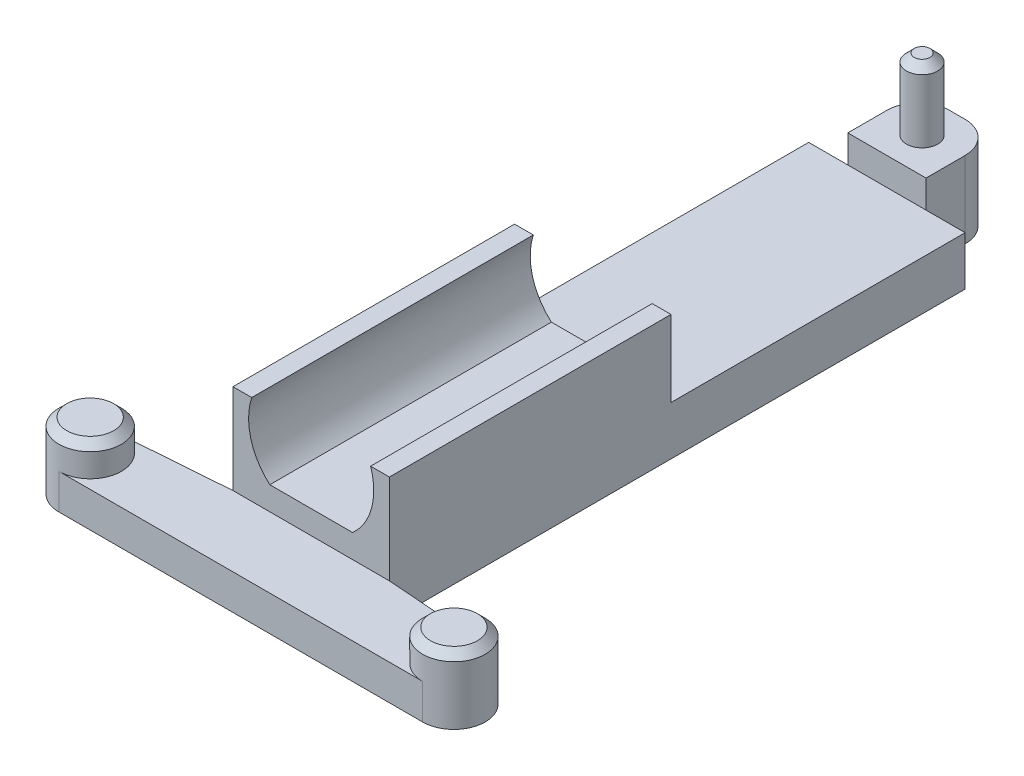
ISO-10303-21;
HEADER;
FILE_DESCRIPTION(('STEP AP214'),'2;1');
FILE_NAME('part.step','',(''),(''),'','','');
FILE_SCHEMA(('AUTOMOTIVE_DESIGN { 1 0 10303 214 1 1 1 1 }'));
ENDSEC;
DATA;
#1=APPLICATION_CONTEXT('core data for automotive mechanical design processes');
#2=APPLICATION_PROTOCOL_DEFINITION('international standard','automotive_design',2000,#1);
#3=PRODUCT_CONTEXT('',#1,'mechanical');
#4=PRODUCT('Part','Part','',(#3));
#5=PRODUCT_RELATED_PRODUCT_CATEGORY('part','',(#4));
#6=PRODUCT_DEFINITION_FORMATION('','',#4);
#7=PRODUCT_DEFINITION_CONTEXT('part definition',#1,'design');
#8=PRODUCT_DEFINITION('design','',#6,#7);
#9=PRODUCT_DEFINITION_SHAPE('','',#8);
#10=(LENGTH_UNIT() NAMED_UNIT(*) SI_UNIT(.MILLI.,.METRE.));
#11=(NAMED_UNIT(*) PLANE_ANGLE_UNIT() SI_UNIT($,.RADIAN.));
#12=(NAMED_UNIT(*) SI_UNIT($,.STERADIAN.) SOLID_ANGLE_UNIT());
#13=UNCERTAINTY_MEASURE_WITH_UNIT(LENGTH_MEASURE(1.E-05),#10,'distance_accuracy_value','');
#14=(GEOMETRIC_REPRESENTATION_CONTEXT(3) GLOBAL_UNCERTAINTY_ASSIGNED_CONTEXT((#13)) GLOBAL_UNIT_ASSIGNED_CONTEXT((#10,
#11,#12)) REPRESENTATION_CONTEXT('',''));
#15=CARTESIAN_POINT('',(0.,0.,0.));
#16=DIRECTION('',(0.,0.,1.));
#17=DIRECTION('',(1.,0.,0.));
#18=AXIS2_PLACEMENT_3D('',#15,#16,#17);
#19=CARTESIAN_POINT('',(0.,4.5,0.));
#20=DIRECTION('',(0.,1.,0.));
#21=DIRECTION('',(0.,0.,1.));
#22=AXIS2_PLACEMENT_3D('',#19,#20,#21);
#23=PLANE('',#22);
#24=CARTESIAN_POINT('',(71.5,4.5,100.));
#25=DIRECTION('',(0.,1.,0.));
#26=DIRECTION('',(0.,0.,1.));
#27=AXIS2_PLACEMENT_3D('',#24,#25,#26);
#28=CIRCLE('',#27,4.00000000000001);
#29=CARTESIAN_POINT('',(71.5,4.5,96.));
#30=VERTEX_POINT('',#29);
#31=CARTESIAN_POINT('',(71.5,4.5,104.));
#32=VERTEX_POINT('',#31);
#33=EDGE_CURVE('E225',#30,#32,#28,.T.);
#34=ORIENTED_EDGE('',*,*,#33,.F.);
#35=DIRECTION('',(-0.997164120486613,0.,-0.0752576694706879));
#36=VECTOR('',#35,1.);
#37=CARTESIAN_POINT('',(71.5,4.5,96.));
#38=LINE('',#37,#36);
#39=CARTESIAN_POINT('',(58.25,4.5,95.));
#40=VERTEX_POINT('',#39);
#41=EDGE_CURVE('E496',#30,#40,#38,.T.);
#42=ORIENTED_EDGE('',*,*,#41,.T.);
#43=DIRECTION('',(1.,0.,0.));
#44=VECTOR('',#43,1.);
#45=CARTESIAN_POINT('',(0.,4.5,95.));
#46=LINE('',#45,#44);
#47=CARTESIAN_POINT('',(38.25,4.5,95.));
#48=VERTEX_POINT('',#47);
#49=EDGE_CURVE('E216',#48,#40,#46,.T.);
#50=ORIENTED_EDGE('',*,*,#49,.F.);
#51=DIRECTION('',(-0.997164120486613,0.,0.0752576694706878));
#52=VECTOR('',#51,1.);
#53=CARTESIAN_POINT('',(38.25,4.5,95.));
#54=LINE('',#53,#52);
#55=CARTESIAN_POINT('',(25.,4.5,96.));
#56=VERTEX_POINT('',#55);
#57=EDGE_CURVE('E199',#48,#56,#54,.T.);
#58=ORIENTED_EDGE('',*,*,#57,.T.);
#59=CARTESIAN_POINT('',(25.,4.5,100.));
#60=DIRECTION('',(0.,1.,0.));
#61=DIRECTION('',(0.,0.,1.));
#62=AXIS2_PLACEMENT_3D('',#59,#60,#61);
#63=CIRCLE('',#62,4.);
#64=CARTESIAN_POINT('',(25.,4.5,104.));
#65=VERTEX_POINT('',#64);
#66=EDGE_CURVE('E213',#65,#56,#63,.T.);
#67=ORIENTED_EDGE('',*,*,#66,.F.);
#68=DIRECTION('',(1.,0.,0.));
#69=VECTOR('',#68,1.);
#70=CARTESIAN_POINT('',(25.,4.5,104.));
#71=LINE('',#70,#69);
#72=EDGE_CURVE('E219',#65,#32,#71,.T.);
#73=ORIENTED_EDGE('',*,*,#72,.T.);
#74=EDGE_LOOP('',(#34,#42,#50,#58,#67,#73));
#75=FACE_BOUND('',#74,.T.);
#76=ADVANCED_FACE('F47',(#75),#23,.T.);
#77=CARTESIAN_POINT('',(0.,16.,0.));
#78=DIRECTION('',(0.,1.,0.));
#79=DIRECTION('',(0.,0.,1.));
#80=AXIS2_PLACEMENT_3D('',#77,#78,#79);
#81=PLANE('',#80);
#82=DIRECTION('',(0.,0.,-1.));
#83=VECTOR('',#82,1.);
#84=CARTESIAN_POINT('',(40.6506579232147,16.,110.));
#85=LINE('',#84,#83);
#86=CARTESIAN_POINT('',(40.6506579232147,16.,59.));
#87=VERTEX_POINT('',#86);
#88=CARTESIAN_POINT('',(40.6506579232147,16.,95.));
#89=VERTEX_POINT('',#88);
#90=EDGE_CURVE('E247',#87,#89,#85,.F.);
#91=ORIENTED_EDGE('',*,*,#90,.F.);
#92=DIRECTION('',(1.,0.,0.));
#93=VECTOR('',#92,1.);
#94=CARTESIAN_POINT('',(0.,16.,59.));
#95=LINE('',#94,#93);
#96=CARTESIAN_POINT('',(38.25,16.,59.));
#97=VERTEX_POINT('',#96);
#98=EDGE_CURVE('E389',#97,#87,#95,.T.);
#99=ORIENTED_EDGE('',*,*,#98,.F.);
#100=DIRECTION('',(0.,0.,1.));
#101=VECTOR('',#100,1.);
#102=CARTESIAN_POINT('',(38.25,16.,0.));
#103=LINE('',#102,#101);
#104=CARTESIAN_POINT('',(38.25,16.,95.));
#105=VERTEX_POINT('',#104);
#106=EDGE_CURVE('E393',#97,#105,#103,.T.);
#107=ORIENTED_EDGE('',*,*,#106,.T.);
#108=DIRECTION('',(1.,0.,0.));
#109=VECTOR('',#108,1.);
#110=CARTESIAN_POINT('',(0.,16.,95.));
#111=LINE('',#110,#109);
#112=EDGE_CURVE('E397',#105,#89,#111,.T.);
#113=ORIENTED_EDGE('',*,*,#112,.T.);
#114=EDGE_LOOP('',(#91,#99,#107,#113));
#115=FACE_BOUND('',#114,.T.);
#116=ADVANCED_FACE('F529',(#115),#81,.T.);
#117=CARTESIAN_POINT('',(0.,6.25,21.4));
#118=DIRECTION('',(0.,0.,1.));
#119=DIRECTION('',(1.,0.,0.));
#120=AXIS2_PLACEMENT_3D('',#117,#118,#119);
#121=PLANE('',#120);
#122=DIRECTION('',(0.,-1.,0.));
#123=VECTOR('',#122,1.);
#124=CARTESIAN_POINT('',(53.25,9.8,21.4));
#125=LINE('',#124,#123);
#126=CARTESIAN_POINT('',(53.25,6.25,21.4));
#127=VERTEX_POINT('',#126);
#128=CARTESIAN_POINT('',(53.25,0.,21.4));
#129=VERTEX_POINT('',#128);
#130=EDGE_CURVE('E374',#127,#129,#125,.T.);
#131=ORIENTED_EDGE('',*,*,#130,.F.);
#132=DIRECTION('',(-1.,0.,0.));
#133=VECTOR('',#132,1.);
#134=CARTESIAN_POINT('',(0.,6.25,21.4));
#135=LINE('',#134,#133);
#136=CARTESIAN_POINT('',(58.25,6.25,21.4));
#137=VERTEX_POINT('',#136);
#138=EDGE_CURVE('E336',#137,#127,#135,.T.);
#139=ORIENTED_EDGE('',*,*,#138,.F.);
#140=DIRECTION('',(0.,-1.,0.));
#141=VECTOR('',#140,1.);
#142=CARTESIAN_POINT('',(58.25,6.25,21.4));
#143=LINE('',#142,#141);
#144=CARTESIAN_POINT('',(58.25,0.,21.4));
#145=VERTEX_POINT('',#144);
#146=EDGE_CURVE('E233',#137,#145,#143,.T.);
#147=ORIENTED_EDGE('',*,*,#146,.T.);
#148=DIRECTION('',(-1.,0.,0.));
#149=VECTOR('',#148,1.);
#150=CARTESIAN_POINT('',(0.,0.,21.4));
#151=LINE('',#150,#149);
#152=EDGE_CURVE('E288',#145,#129,#151,.T.);
#153=ORIENTED_EDGE('',*,*,#152,.T.);
#154=EDGE_LOOP('',(#131,#139,#147,#153));
#155=FACE_BOUND('',#154,.T.);
#156=ADVANCED_FACE('F354',(#155),#121,.F.);
#157=DIRECTION('',(0.,-1.,0.));
#158=VECTOR('',#157,1.);
#159=CARTESIAN_POINT('',(43.25,9.8,21.4));
#160=LINE('',#159,#158);
#161=CARTESIAN_POINT('',(43.25,6.25,21.4));
#162=VERTEX_POINT('',#161);
#163=CARTESIAN_POINT('',(43.25,0.,21.4));
#164=VERTEX_POINT('',#163);
#165=EDGE_CURVE('E320',#162,#164,#160,.T.);
#166=ORIENTED_EDGE('',*,*,#165,.T.);
#167=DIRECTION('',(-1.,0.,0.));
#168=VECTOR('',#167,1.);
#169=CARTESIAN_POINT('',(0.,0.,21.4));
#170=LINE('',#169,#168);
#171=CARTESIAN_POINT('',(38.25,0.,21.4));
#172=VERTEX_POINT('',#171);
#173=EDGE_CURVE('E57',#164,#172,#170,.T.);
#174=ORIENTED_EDGE('',*,*,#173,.T.);
#175=DIRECTION('',(0.,-1.,0.));
#176=VECTOR('',#175,1.);
#177=CARTESIAN_POINT('',(38.25,6.25,21.4));
#178=LINE('',#177,#176);
#179=CARTESIAN_POINT('',(38.25,6.25,21.4));
#180=VERTEX_POINT('',#179);
#181=EDGE_CURVE('E226',#180,#172,#178,.T.);
#182=ORIENTED_EDGE('',*,*,#181,.F.);
#183=EDGE_CURVE('E345',#162,#180,#135,.T.);
#184=ORIENTED_EDGE('',*,*,#183,.F.);
#185=EDGE_LOOP('',(#166,#174,#182,#184));
#186=FACE_BOUND('',#185,.T.);
#187=ADVANCED_FACE('F317',(#186),#121,.F.);
#188=CARTESIAN_POINT('',(25.,8.5,100.));
#189=DIRECTION('',(0.,-1.,0.));
#190=DIRECTION('',(0.,0.,-1.));
#191=AXIS2_PLACEMENT_3D('',#188,#189,#190);
#192=CYLINDRICAL_SURFACE('',#191,4.);
#193=CARTESIAN_POINT('',(25.,7.5,100.));
#194=DIRECTION('',(0.,1.,0.));
#195=DIRECTION('',(0.,0.,1.));
#196=AXIS2_PLACEMENT_3D('',#193,#194,#195);
#197=CIRCLE('',#196,4.);
#198=CARTESIAN_POINT('',(25.,7.5,104.));
#199=VERTEX_POINT('',#198);
#200=EDGE_CURVE('E266',#199,#199,#197,.F.);
#201=ORIENTED_EDGE('',*,*,#200,.T.);
#202=EDGE_LOOP('',(#201));
#203=FACE_BOUND('',#202,.T.);
#204=ORIENTED_EDGE('',*,*,#66,.T.);
#205=DIRECTION('',(0.,1.,0.));
#206=VECTOR('',#205,1.);
#207=CARTESIAN_POINT('',(25.,-5.5,96.));
#208=LINE('',#207,#206);
#209=CARTESIAN_POINT('',(25.,0.,96.));
#210=VERTEX_POINT('',#209);
#211=EDGE_CURVE('E196',#210,#56,#208,.T.);
#212=ORIENTED_EDGE('',*,*,#211,.F.);
#213=CARTESIAN_POINT('',(25.,0.,100.));
#214=DIRECTION('',(0.,1.,0.));
#215=DIRECTION('',(0.,0.,1.));
#216=AXIS2_PLACEMENT_3D('',#213,#214,#215);
#217=CIRCLE('',#216,4.);
#218=CARTESIAN_POINT('',(25.,0.,104.));
#219=VERTEX_POINT('',#218);
#220=EDGE_CURVE('E272',#210,#219,#217,.T.);
#221=ORIENTED_EDGE('',*,*,#220,.T.);
#222=DIRECTION('',(0.,1.,0.));
#223=VECTOR('',#222,1.);
#224=CARTESIAN_POINT('',(25.,-5.5,104.));
#225=LINE('',#224,#223);
#226=EDGE_CURVE('E207',#219,#65,#225,.T.);
#227=ORIENTED_EDGE('',*,*,#226,.T.);
#228=EDGE_LOOP('',(#204,#212,#221,#227));
#229=FACE_BOUND('',#228,.T.);
#230=ADVANCED_FACE('F221',(#203,#229),#192,.T.);
#231=CARTESIAN_POINT('',(0.,8.5,0.));
#232=DIRECTION('',(0.,1.,0.));
#233=DIRECTION('',(0.,0.,1.));
#234=AXIS2_PLACEMENT_3D('',#231,#232,#233);
#235=PLANE('',#234);
#236=CARTESIAN_POINT('',(25.,8.5,100.));
#237=DIRECTION('',(0.,1.,0.));
#238=DIRECTION('',(0.,0.,1.));
#239=AXIS2_PLACEMENT_3D('',#236,#237,#238);
#240=CIRCLE('',#239,3.);
#241=CARTESIAN_POINT('',(25.,8.5,103.));
#242=VERTEX_POINT('',#241);
#243=EDGE_CURVE('E262',#242,#242,#240,.T.);
#244=ORIENTED_EDGE('',*,*,#243,.T.);
#245=EDGE_LOOP('',(#244));
#246=FACE_BOUND('',#245,.T.);
#247=ADVANCED_FACE('F588',(#246),#235,.T.);
#248=CARTESIAN_POINT('',(71.5,8.5,100.));
#249=DIRECTION('',(0.,-1.,0.));
#250=DIRECTION('',(0.,0.,-1.));
#251=AXIS2_PLACEMENT_3D('',#248,#249,#250);
#252=CYLINDRICAL_SURFACE('',#251,4.00000000000001);
#253=CARTESIAN_POINT('',(71.5,7.49999999999998,100.));
#254=DIRECTION('',(0.,1.,0.));
#255=DIRECTION('',(0.,0.,1.));
#256=AXIS2_PLACEMENT_3D('',#253,#254,#255);
#257=CIRCLE('',#256,4.00000000000001);
#258=CARTESIAN_POINT('',(71.5,7.49999999999998,104.));
#259=VERTEX_POINT('',#258);
#260=EDGE_CURVE('E254',#259,#259,#257,.F.);
#261=ORIENTED_EDGE('',*,*,#260,.T.);
#262=EDGE_LOOP('',(#261));
#263=FACE_BOUND('',#262,.T.);
#264=ORIENTED_EDGE('',*,*,#33,.T.);
#265=DIRECTION('',(0.,1.,0.));
#266=VECTOR('',#265,1.);
#267=CARTESIAN_POINT('',(71.5,-5.5,104.));
#268=LINE('',#267,#266);
#269=CARTESIAN_POINT('',(71.5,0.,104.));
#270=VERTEX_POINT('',#269);
#271=EDGE_CURVE('E500',#270,#32,#268,.T.);
#272=ORIENTED_EDGE('',*,*,#271,.F.);
#273=CARTESIAN_POINT('',(71.5,0.,100.));
#274=DIRECTION('',(0.,1.,0.));
#275=DIRECTION('',(0.,0.,1.));
#276=AXIS2_PLACEMENT_3D('',#273,#274,#275);
#277=CIRCLE('',#276,4.);
#278=CARTESIAN_POINT('',(71.5,0.,96.));
#279=VERTEX_POINT('',#278);
#280=EDGE_CURVE('E278',#270,#279,#277,.T.);
#281=ORIENTED_EDGE('',*,*,#280,.T.);
#282=DIRECTION('',(0.,1.,0.));
#283=VECTOR('',#282,1.);
#284=CARTESIAN_POINT('',(71.5,-5.5,96.));
#285=LINE('',#284,#283);
#286=EDGE_CURVE('E503',#279,#30,#285,.T.);
#287=ORIENTED_EDGE('',*,*,#286,.T.);
#288=EDGE_LOOP('',(#264,#272,#281,#287));
#289=FACE_BOUND('',#288,.T.);
#290=ADVANCED_FACE('F514',(#263,#289),#252,.T.);
#291=CARTESIAN_POINT('',(0.,8.5,0.));
#292=DIRECTION('',(0.,1.,0.));
#293=DIRECTION('',(0.,0.,1.));
#294=AXIS2_PLACEMENT_3D('',#291,#292,#293);
#295=PLANE('',#294);
#296=CARTESIAN_POINT('',(71.5,8.5,100.));
#297=DIRECTION('',(0.,1.,0.));
#298=DIRECTION('',(0.,0.,1.));
#299=AXIS2_PLACEMENT_3D('',#296,#297,#298);
#300=CIRCLE('',#299,2.99999999999999);
#301=CARTESIAN_POINT('',(71.5,8.5,103.));
#302=VERTEX_POINT('',#301);
#303=EDGE_CURVE('E258',#302,#302,#300,.T.);
#304=ORIENTED_EDGE('',*,*,#303,.T.);
#305=EDGE_LOOP('',(#304));
#306=FACE_BOUND('',#305,.T.);
#307=ADVANCED_FACE('F587',(#306),#295,.T.);
#308=CARTESIAN_POINT('',(38.25,6.25,0.));
#309=DIRECTION('',(1.,0.,0.));
#310=DIRECTION('',(0.,0.,-1.));
#311=AXIS2_PLACEMENT_3D('',#308,#309,#310);
#312=PLANE('',#311);
#313=ORIENTED_EDGE('',*,*,#181,.T.);
#314=DIRECTION('',(0.,0.,1.));
#315=VECTOR('',#314,1.);
#316=CARTESIAN_POINT('',(38.25,0.,0.));
#317=LINE('',#316,#315);
#318=CARTESIAN_POINT('',(38.25,0.,95.));
#319=VERTEX_POINT('',#318);
#320=EDGE_CURVE('E11',#172,#319,#317,.T.);
#321=ORIENTED_EDGE('',*,*,#320,.T.);
#322=DIRECTION('',(0.,1.,0.));
#323=VECTOR('',#322,1.);
#324=CARTESIAN_POINT('',(38.25,-5.5,95.));
#325=LINE('',#324,#323);
#326=EDGE_CURVE('E64',#319,#48,#325,.T.);
#327=ORIENTED_EDGE('',*,*,#326,.T.);
#328=DIRECTION('',(0.,-1.,0.));
#329=VECTOR('',#328,1.);
#330=CARTESIAN_POINT('',(38.25,16.,95.));
#331=LINE('',#330,#329);
#332=EDGE_CURVE('E406',#105,#48,#331,.T.);
#333=ORIENTED_EDGE('',*,*,#332,.F.);
#334=ORIENTED_EDGE('',*,*,#106,.F.);
#335=DIRECTION('',(0.,-1.,0.));
#336=VECTOR('',#335,1.);
#337=CARTESIAN_POINT('',(38.25,16.,59.));
#338=LINE('',#337,#336);
#339=CARTESIAN_POINT('',(38.25,6.25,59.));
#340=VERTEX_POINT('',#339);
#341=EDGE_CURVE('E331',#97,#340,#338,.T.);
#342=ORIENTED_EDGE('',*,*,#341,.T.);
#343=DIRECTION('',(0.,0.,1.));
#344=VECTOR('',#343,1.);
#345=CARTESIAN_POINT('',(38.25,6.25,0.));
#346=LINE('',#345,#344);
#347=EDGE_CURVE('E329',#180,#340,#346,.T.);
#348=ORIENTED_EDGE('',*,*,#347,.F.);
#349=EDGE_LOOP('',(#313,#321,#327,#333,#334,#342,#348));
#350=FACE_BOUND('',#349,.T.);
#351=ADVANCED_FACE('F325',(#350),#312,.F.);
#352=CARTESIAN_POINT('',(58.25,6.25,0.));
#353=DIRECTION('',(1.,0.,0.));
#354=DIRECTION('',(0.,0.,-1.));
#355=AXIS2_PLACEMENT_3D('',#352,#353,#354);
#356=PLANE('',#355);
#357=DIRECTION('',(0.,-1.,0.));
#358=VECTOR('',#357,1.);
#359=CARTESIAN_POINT('',(58.25,16.,95.));
#360=LINE('',#359,#358);
#361=CARTESIAN_POINT('',(58.25,16.,95.));
#362=VERTEX_POINT('',#361);
#363=EDGE_CURVE('E401',#362,#40,#360,.T.);
#364=ORIENTED_EDGE('',*,*,#363,.T.);
#365=DIRECTION('',(0.,1.,0.));
#366=VECTOR('',#365,1.);
#367=CARTESIAN_POINT('',(58.25,-5.5,95.));
#368=LINE('',#367,#366);
#369=CARTESIAN_POINT('',(58.25,0.,95.));
#370=VERTEX_POINT('',#369);
#371=EDGE_CURVE('E363',#370,#40,#368,.T.);
#372=ORIENTED_EDGE('',*,*,#371,.F.);
#373=DIRECTION('',(0.,0.,-1.));
#374=VECTOR('',#373,1.);
#375=CARTESIAN_POINT('',(58.25,0.,0.));
#376=LINE('',#375,#374);
#377=EDGE_CURVE('E284',#370,#145,#376,.T.);
#378=ORIENTED_EDGE('',*,*,#377,.T.);
#379=ORIENTED_EDGE('',*,*,#146,.F.);
#380=DIRECTION('',(0.,0.,1.));
#381=VECTOR('',#380,1.);
#382=CARTESIAN_POINT('',(58.25,6.25,0.));
#383=LINE('',#382,#381);
#384=CARTESIAN_POINT('',(58.25,6.25,59.));
#385=VERTEX_POINT('',#384);
#386=EDGE_CURVE('E340',#137,#385,#383,.T.);
#387=ORIENTED_EDGE('',*,*,#386,.T.);
#388=DIRECTION('',(0.,-1.,0.));
#389=VECTOR('',#388,1.);
#390=CARTESIAN_POINT('',(58.25,16.,59.));
#391=LINE('',#390,#389);
#392=CARTESIAN_POINT('',(58.25,16.,59.));
#393=VERTEX_POINT('',#392);
#394=EDGE_CURVE('E410',#393,#385,#391,.T.);
#395=ORIENTED_EDGE('',*,*,#394,.F.);
#396=DIRECTION('',(0.,0.,1.));
#397=VECTOR('',#396,1.);
#398=CARTESIAN_POINT('',(58.25,16.,0.));
#399=LINE('',#398,#397);
#400=EDGE_CURVE('E384',#393,#362,#399,.T.);
#401=ORIENTED_EDGE('',*,*,#400,.T.);
#402=EDGE_LOOP('',(#364,#372,#378,#379,#387,#395,#401));
#403=FACE_BOUND('',#402,.T.);
#404=ADVANCED_FACE('F362',(#403),#356,.T.);
#405=CARTESIAN_POINT('',(0.,6.25,0.));
#406=DIRECTION('',(0.,1.,0.));
#407=DIRECTION('',(0.,0.,1.));
#408=AXIS2_PLACEMENT_3D('',#405,#406,#407);
#409=PLANE('',#408);
#410=ORIENTED_EDGE('',*,*,#138,.T.);
#411=EDGE_CURVE('E343',#127,#162,#135,.T.);
#412=ORIENTED_EDGE('',*,*,#411,.T.);
#413=ORIENTED_EDGE('',*,*,#183,.T.);
#414=ORIENTED_EDGE('',*,*,#347,.T.);
#415=DIRECTION('',(-1.,0.,0.));
#416=VECTOR('',#415,1.);
#417=CARTESIAN_POINT('',(0.,6.25,59.));
#418=LINE('',#417,#416);
#419=EDGE_CURVE('E335',#385,#340,#418,.T.);
#420=ORIENTED_EDGE('',*,*,#419,.F.);
#421=ORIENTED_EDGE('',*,*,#386,.F.);
#422=EDGE_LOOP('',(#410,#412,#413,#414,#420,#421));
#423=FACE_BOUND('',#422,.T.);
#424=ADVANCED_FACE('F418',(#423),#409,.T.);
#425=CARTESIAN_POINT('',(0.,16.,59.));
#426=DIRECTION('',(0.,0.,-1.));
#427=DIRECTION('',(-1.,0.,0.));
#428=AXIS2_PLACEMENT_3D('',#425,#426,#427);
#429=PLANE('',#428);
#430=CARTESIAN_POINT('',(48.25,13.5,59.));
#431=DIRECTION('',(0.,0.,-1.));
#432=DIRECTION('',(-1.,0.,0.));
#433=AXIS2_PLACEMENT_3D('',#430,#431,#432);
#434=CIRCLE('',#433,8.);
#435=CARTESIAN_POINT('',(42.9584973778708,7.5,59.));
#436=VERTEX_POINT('',#435);
#437=EDGE_CURVE('E484',#436,#87,#434,.T.);
#438=ORIENTED_EDGE('',*,*,#437,.F.);
#439=DIRECTION('',(-1.,0.,0.));
#440=VECTOR('',#439,1.);
#441=CARTESIAN_POINT('',(0.,7.5,59.));
#442=LINE('',#441,#440);
#443=CARTESIAN_POINT('',(53.5415026221292,7.5,59.));
#444=VERTEX_POINT('',#443);
#445=EDGE_CURVE('E487',#444,#436,#442,.T.);
#446=ORIENTED_EDGE('',*,*,#445,.F.);
#447=CARTESIAN_POINT('',(55.8493420767853,16.,59.));
#448=VERTEX_POINT('',#447);
#449=EDGE_CURVE('E491',#448,#444,#434,.T.);
#450=ORIENTED_EDGE('',*,*,#449,.F.);
#451=EDGE_CURVE('E388',#448,#393,#95,.T.);
#452=ORIENTED_EDGE('',*,*,#451,.T.);
#453=ORIENTED_EDGE('',*,*,#394,.T.);
#454=ORIENTED_EDGE('',*,*,#419,.T.);
#455=ORIENTED_EDGE('',*,*,#341,.F.);
#456=ORIENTED_EDGE('',*,*,#98,.T.);
#457=EDGE_LOOP('',(#438,#446,#450,#452,#453,#454,#455,#456));
#458=FACE_BOUND('',#457,.T.);
#459=ADVANCED_FACE('F531',(#458),#429,.T.);
#460=CARTESIAN_POINT('',(0.,16.,95.));
#461=DIRECTION('',(0.,0.,-1.));
#462=DIRECTION('',(-1.,0.,0.));
#463=AXIS2_PLACEMENT_3D('',#460,#461,#462);
#464=PLANE('',#463);
#465=DIRECTION('',(-1.,0.,0.));
#466=VECTOR('',#465,1.);
#467=CARTESIAN_POINT('',(0.,7.5,95.));
#468=LINE('',#467,#466);
#469=CARTESIAN_POINT('',(53.5415026221292,7.5,95.));
#470=VERTEX_POINT('',#469);
#471=CARTESIAN_POINT('',(42.9584973778708,7.5,95.));
#472=VERTEX_POINT('',#471);
#473=EDGE_CURVE('E250',#470,#472,#468,.T.);
#474=ORIENTED_EDGE('',*,*,#473,.T.);
#475=CARTESIAN_POINT('',(48.25,13.5,95.));
#476=DIRECTION('',(0.,0.,-1.));
#477=DIRECTION('',(-1.,0.,0.));
#478=AXIS2_PLACEMENT_3D('',#475,#476,#477);
#479=CIRCLE('',#478,8.);
#480=EDGE_CURVE('E474',#472,#89,#479,.T.);
#481=ORIENTED_EDGE('',*,*,#480,.T.);
#482=ORIENTED_EDGE('',*,*,#112,.F.);
#483=ORIENTED_EDGE('',*,*,#332,.T.);
#484=ORIENTED_EDGE('',*,*,#49,.T.);
#485=ORIENTED_EDGE('',*,*,#363,.F.);
#486=CARTESIAN_POINT('',(55.8493420767853,16.,95.));
#487=VERTEX_POINT('',#486);
#488=EDGE_CURVE('E396',#487,#362,#111,.T.);
#489=ORIENTED_EDGE('',*,*,#488,.F.);
#490=CARTESIAN_POINT('',(48.25,13.5,95.));
#491=DIRECTION('',(0.,0.,-1.));
#492=DIRECTION('',(-1.,0.,0.));
#493=AXIS2_PLACEMENT_3D('',#490,#491,#492);
#494=CIRCLE('',#493,8.);
#495=EDGE_CURVE('E71',#487,#470,#494,.T.);
#496=ORIENTED_EDGE('',*,*,#495,.T.);
#497=EDGE_LOOP('',(#474,#481,#482,#483,#484,#485,#489,#496));
#498=FACE_BOUND('',#497,.T.);
#499=ADVANCED_FACE('F524',(#498),#464,.F.);
#500=DIRECTION('',(0.,0.,-1.));
#501=VECTOR('',#500,1.);
#502=CARTESIAN_POINT('',(55.8493420767853,16.,110.));
#503=LINE('',#502,#501);
#504=EDGE_CURVE('E244',#487,#448,#503,.T.);
#505=ORIENTED_EDGE('',*,*,#504,.F.);
#506=ORIENTED_EDGE('',*,*,#488,.T.);
#507=ORIENTED_EDGE('',*,*,#400,.F.);
#508=ORIENTED_EDGE('',*,*,#451,.F.);
#509=EDGE_LOOP('',(#505,#506,#507,#508));
#510=FACE_BOUND('',#509,.T.);
#511=ADVANCED_FACE('F535',(#510),#81,.T.);
#512=CARTESIAN_POINT('',(0.,9.8,21.4));
#513=DIRECTION('',(0.,0.,1.));
#514=DIRECTION('',(1.,0.,0.));
#515=AXIS2_PLACEMENT_3D('',#512,#513,#514);
#516=PLANE('',#515);
#517=CARTESIAN_POINT('',(43.25,9.8,21.4));
#518=VERTEX_POINT('',#517);
#519=EDGE_CURVE('E423',#518,#162,#160,.T.);
#520=ORIENTED_EDGE('',*,*,#519,.T.);
#521=ORIENTED_EDGE('',*,*,#411,.F.);
#522=CARTESIAN_POINT('',(53.25,9.8,21.4));
#523=VERTEX_POINT('',#522);
#524=EDGE_CURVE('E375',#523,#127,#125,.T.);
#525=ORIENTED_EDGE('',*,*,#524,.F.);
#526=DIRECTION('',(-1.,0.,0.));
#527=VECTOR('',#526,1.);
#528=CARTESIAN_POINT('',(0.,9.8,21.4));
#529=LINE('',#528,#527);
#530=EDGE_CURVE('E425',#523,#518,#529,.T.);
#531=ORIENTED_EDGE('',*,*,#530,.T.);
#532=EDGE_LOOP('',(#520,#521,#525,#531));
#533=FACE_BOUND('',#532,.T.);
#534=ADVANCED_FACE('F420',(#533),#516,.T.);
#535=CARTESIAN_POINT('',(53.25,9.8,0.));
#536=DIRECTION('',(-1.,0.,0.));
#537=DIRECTION('',(0.,0.,1.));
#538=AXIS2_PLACEMENT_3D('',#535,#536,#537);
#539=PLANE('',#538);
#540=ORIENTED_EDGE('',*,*,#130,.T.);
#541=DIRECTION('',(0.,0.,-1.));
#542=VECTOR('',#541,1.);
#543=CARTESIAN_POINT('',(53.25,0.,0.));
#544=LINE('',#543,#542);
#545=CARTESIAN_POINT('',(53.25,0.,16.4));
#546=VERTEX_POINT('',#545);
#547=EDGE_CURVE('E292',#129,#546,#544,.T.);
#548=ORIENTED_EDGE('',*,*,#547,.T.);
#549=DIRECTION('',(0.,-1.,0.));
#550=VECTOR('',#549,1.);
#551=CARTESIAN_POINT('',(53.25,9.8,16.4));
#552=LINE('',#551,#550);
#553=CARTESIAN_POINT('',(53.25,9.8,16.4));
#554=VERTEX_POINT('',#553);
#555=EDGE_CURVE('E371',#554,#546,#552,.T.);
#556=ORIENTED_EDGE('',*,*,#555,.F.);
#557=DIRECTION('',(0.,0.,-1.));
#558=VECTOR('',#557,1.);
#559=CARTESIAN_POINT('',(53.25,9.8,0.));
#560=LINE('',#559,#558);
#561=EDGE_CURVE('E469',#523,#554,#560,.T.);
#562=ORIENTED_EDGE('',*,*,#561,.F.);
#563=ORIENTED_EDGE('',*,*,#524,.T.);
#564=EDGE_LOOP('',(#540,#548,#556,#562,#563));
#565=FACE_BOUND('',#564,.T.);
#566=ADVANCED_FACE('F369',(#565),#539,.F.);
#567=CARTESIAN_POINT('',(49.25,9.8,16.4));
#568=DIRECTION('',(0.,-1.,0.));
#569=DIRECTION('',(0.,0.,-1.));
#570=AXIS2_PLACEMENT_3D('',#567,#568,#569);
#571=CYLINDRICAL_SURFACE('',#570,4.);
#572=ORIENTED_EDGE('',*,*,#555,.T.);
#573=CARTESIAN_POINT('',(49.25,0.,16.4));
#574=DIRECTION('',(0.,1.,0.));
#575=DIRECTION('',(0.,0.,1.));
#576=AXIS2_PLACEMENT_3D('',#573,#574,#575);
#577=CIRCLE('',#576,3.99999999999999);
#578=CARTESIAN_POINT('',(49.25,0.,12.4));
#579=VERTEX_POINT('',#578);
#580=EDGE_CURVE('E296',#546,#579,#577,.T.);
#581=ORIENTED_EDGE('',*,*,#580,.T.);
#582=DIRECTION('',(0.,-1.,0.));
#583=VECTOR('',#582,1.);
#584=CARTESIAN_POINT('',(49.25,9.8,12.4));
#585=LINE('',#584,#583);
#586=CARTESIAN_POINT('',(49.25,9.8,12.4));
#587=VERTEX_POINT('',#586);
#588=EDGE_CURVE('E380',#587,#579,#585,.T.);
#589=ORIENTED_EDGE('',*,*,#588,.F.);
#590=CARTESIAN_POINT('',(49.25,9.8,16.4));
#591=DIRECTION('',(0.,1.,0.));
#592=DIRECTION('',(0.,0.,1.));
#593=AXIS2_PLACEMENT_3D('',#590,#591,#592);
#594=CIRCLE('',#593,4.);
#595=EDGE_CURVE('E464',#587,#554,#594,.F.);
#596=ORIENTED_EDGE('',*,*,#595,.T.);
#597=EDGE_LOOP('',(#572,#581,#589,#596));
#598=FACE_BOUND('',#597,.T.);
#599=ADVANCED_FACE('F453',(#598),#571,.T.);
#600=CARTESIAN_POINT('',(0.,9.8,12.4));
#601=DIRECTION('',(0.,0.,1.));
#602=DIRECTION('',(1.,0.,0.));
#603=AXIS2_PLACEMENT_3D('',#600,#601,#602);
#604=PLANE('',#603);
#605=ORIENTED_EDGE('',*,*,#588,.T.);
#606=DIRECTION('',(-1.,0.,0.));
#607=VECTOR('',#606,1.);
#608=CARTESIAN_POINT('',(0.,0.,12.4));
#609=LINE('',#608,#607);
#610=CARTESIAN_POINT('',(47.25,0.,12.4));
#611=VERTEX_POINT('',#610);
#612=EDGE_CURVE('E300',#579,#611,#609,.T.);
#613=ORIENTED_EDGE('',*,*,#612,.T.);
#614=DIRECTION('',(0.,-1.,0.));
#615=VECTOR('',#614,1.);
#616=CARTESIAN_POINT('',(47.25,9.8,12.4));
#617=LINE('',#616,#615);
#618=CARTESIAN_POINT('',(47.25,9.8,12.4));
#619=VERTEX_POINT('',#618);
#620=EDGE_CURVE('E442',#619,#611,#617,.T.);
#621=ORIENTED_EDGE('',*,*,#620,.F.);
#622=DIRECTION('',(-1.,0.,0.));
#623=VECTOR('',#622,1.);
#624=CARTESIAN_POINT('',(0.,9.8,12.4));
#625=LINE('',#624,#623);
#626=EDGE_CURVE('E450',#587,#619,#625,.T.);
#627=ORIENTED_EDGE('',*,*,#626,.F.);
#628=EDGE_LOOP('',(#605,#613,#621,#627));
#629=FACE_BOUND('',#628,.T.);
#630=ADVANCED_FACE('F447',(#629),#604,.F.);
#631=CARTESIAN_POINT('',(47.25,9.8,16.4));
#632=DIRECTION('',(0.,-1.,0.));
#633=DIRECTION('',(0.,0.,-1.));
#634=AXIS2_PLACEMENT_3D('',#631,#632,#633);
#635=CYLINDRICAL_SURFACE('',#634,4.);
#636=ORIENTED_EDGE('',*,*,#620,.T.);
#637=CARTESIAN_POINT('',(47.25,0.,16.4));
#638=DIRECTION('',(0.,1.,0.));
#639=DIRECTION('',(0.,0.,1.));
#640=AXIS2_PLACEMENT_3D('',#637,#638,#639);
#641=CIRCLE('',#640,4.);
#642=CARTESIAN_POINT('',(43.25,0.,16.4));
#643=VERTEX_POINT('',#642);
#644=EDGE_CURVE('E304',#611,#643,#641,.T.);
#645=ORIENTED_EDGE('',*,*,#644,.T.);
#646=DIRECTION('',(0.,-1.,0.));
#647=VECTOR('',#646,1.);
#648=CARTESIAN_POINT('',(43.25,9.8,16.4));
#649=LINE('',#648,#647);
#650=CARTESIAN_POINT('',(43.25,9.8,16.4));
#651=VERTEX_POINT('',#650);
#652=EDGE_CURVE('E429',#651,#643,#649,.T.);
#653=ORIENTED_EDGE('',*,*,#652,.F.);
#654=CARTESIAN_POINT('',(47.25,9.8,16.4));
#655=DIRECTION('',(0.,1.,0.));
#656=DIRECTION('',(0.,0.,1.));
#657=AXIS2_PLACEMENT_3D('',#654,#655,#656);
#658=CIRCLE('',#657,4.);
#659=EDGE_CURVE('E458',#651,#619,#658,.F.);
#660=ORIENTED_EDGE('',*,*,#659,.T.);
#661=EDGE_LOOP('',(#636,#645,#653,#660));
#662=FACE_BOUND('',#661,.T.);
#663=ADVANCED_FACE('F455',(#662),#635,.T.);
#664=CARTESIAN_POINT('',(43.25,9.8,0.));
#665=DIRECTION('',(1.,0.,0.));
#666=DIRECTION('',(0.,0.,-1.));
#667=AXIS2_PLACEMENT_3D('',#664,#665,#666);
#668=PLANE('',#667);
#669=ORIENTED_EDGE('',*,*,#652,.T.);
#670=DIRECTION('',(0.,0.,1.));
#671=VECTOR('',#670,1.);
#672=CARTESIAN_POINT('',(43.25,0.,0.));
#673=LINE('',#672,#671);
#674=EDGE_CURVE('E308',#643,#164,#673,.T.);
#675=ORIENTED_EDGE('',*,*,#674,.T.);
#676=ORIENTED_EDGE('',*,*,#165,.F.);
#677=ORIENTED_EDGE('',*,*,#519,.F.);
#678=DIRECTION('',(0.,0.,1.));
#679=VECTOR('',#678,1.);
#680=CARTESIAN_POINT('',(43.25,9.8,0.));
#681=LINE('',#680,#679);
#682=EDGE_CURVE('E436',#651,#518,#681,.T.);
#683=ORIENTED_EDGE('',*,*,#682,.F.);
#684=EDGE_LOOP('',(#669,#675,#676,#677,#683));
#685=FACE_BOUND('',#684,.T.);
#686=ADVANCED_FACE('F431',(#685),#668,.F.);
#687=CARTESIAN_POINT('',(0.,9.8,0.));
#688=DIRECTION('',(0.,1.,0.));
#689=DIRECTION('',(0.,0.,1.));
#690=AXIS2_PLACEMENT_3D('',#687,#688,#689);
#691=PLANE('',#690);
#692=ORIENTED_EDGE('',*,*,#530,.F.);
#693=ORIENTED_EDGE('',*,*,#561,.T.);
#694=ORIENTED_EDGE('',*,*,#595,.F.);
#695=ORIENTED_EDGE('',*,*,#626,.T.);
#696=ORIENTED_EDGE('',*,*,#659,.F.);
#697=ORIENTED_EDGE('',*,*,#682,.T.);
#698=EDGE_LOOP('',(#692,#693,#694,#695,#696,#697));
#699=FACE_BOUND('',#698,.T.);
#700=CARTESIAN_POINT('',(48.25,9.8,16.9));
#701=DIRECTION('',(0.,1.,0.));
#702=DIRECTION('',(0.,0.,1.));
#703=AXIS2_PLACEMENT_3D('',#700,#701,#702);
#704=CIRCLE('',#703,2.);
#705=CARTESIAN_POINT('',(48.25,9.8,18.9));
#706=VERTEX_POINT('',#705);
#707=EDGE_CURVE('E433',#706,#706,#704,.F.);
#708=ORIENTED_EDGE('',*,*,#707,.T.);
#709=EDGE_LOOP('',(#708));
#710=FACE_BOUND('',#709,.T.);
#711=ADVANCED_FACE('F604',(#699,#710),#691,.T.);
#712=CARTESIAN_POINT('',(48.25,18.9,16.9));
#713=DIRECTION('',(0.,1.,0.));
#714=DIRECTION('',(0.,0.,1.));
#715=AXIS2_PLACEMENT_3D('',#712,#713,#714);
#716=PLANE('',#715);
#717=CARTESIAN_POINT('',(48.25,18.9,16.9));
#718=DIRECTION('',(0.,1.,0.));
#719=DIRECTION('',(0.,0.,1.));
#720=AXIS2_PLACEMENT_3D('',#717,#718,#719);
#721=CIRCLE('',#720,0.999999999999973);
#722=CARTESIAN_POINT('',(48.25,18.9,17.9));
#723=VERTEX_POINT('',#722);
#724=EDGE_CURVE('E231',#723,#723,#721,.T.);
#725=ORIENTED_EDGE('',*,*,#724,.T.);
#726=EDGE_LOOP('',(#725));
#727=FACE_BOUND('',#726,.T.);
#728=ADVANCED_FACE('F600',(#727),#716,.T.);
#729=CARTESIAN_POINT('',(48.25,18.9,16.9));
#730=DIRECTION('',(0.,-1.,0.));
#731=DIRECTION('',(0.,0.,-1.));
#732=AXIS2_PLACEMENT_3D('',#729,#730,#731);
#733=CYLINDRICAL_SURFACE('',#732,2.);
#734=CARTESIAN_POINT('',(48.25,17.9,16.9));
#735=DIRECTION('',(0.,1.,0.));
#736=DIRECTION('',(0.,0.,1.));
#737=AXIS2_PLACEMENT_3D('',#734,#735,#736);
#738=CIRCLE('',#737,2.);
#739=CARTESIAN_POINT('',(48.25,17.9,18.9));
#740=VERTEX_POINT('',#739);
#741=EDGE_CURVE('E240',#740,#740,#738,.F.);
#742=ORIENTED_EDGE('',*,*,#741,.T.);
#743=EDGE_LOOP('',(#742));
#744=FACE_BOUND('',#743,.T.);
#745=ORIENTED_EDGE('',*,*,#707,.F.);
#746=EDGE_LOOP('',(#745));
#747=FACE_BOUND('',#746,.T.);
#748=ADVANCED_FACE('F572',(#744,#747),#733,.T.);
#749=CARTESIAN_POINT('',(48.25,18.9,16.9));
#750=DIRECTION('',(0.,-1.,0.));
#751=DIRECTION('',(0.,0.,-1.));
#752=AXIS2_PLACEMENT_3D('',#749,#750,#751);
#753=CONICAL_SURFACE('',#752,0.999999999999973,0.785398163397453);
#754=ORIENTED_EDGE('',*,*,#741,.F.);
#755=EDGE_LOOP('',(#754));
#756=FACE_BOUND('',#755,.T.);
#757=ORIENTED_EDGE('',*,*,#724,.F.);
#758=EDGE_LOOP('',(#757));
#759=FACE_BOUND('',#758,.T.);
#760=ADVANCED_FACE('F553',(#756,#759),#753,.T.);
#761=CARTESIAN_POINT('',(0.,7.5,110.));
#762=DIRECTION('',(0.,-1.,0.));
#763=DIRECTION('',(0.,0.,-1.));
#764=AXIS2_PLACEMENT_3D('',#761,#762,#763);
#765=PLANE('',#764);
#766=DIRECTION('',(0.,0.,-1.));
#767=VECTOR('',#766,1.);
#768=CARTESIAN_POINT('',(53.5415026221292,7.5,110.));
#769=LINE('',#768,#767);
#770=EDGE_CURVE('E481',#470,#444,#769,.T.);
#771=ORIENTED_EDGE('',*,*,#770,.T.);
#772=ORIENTED_EDGE('',*,*,#445,.T.);
#773=DIRECTION('',(0.,0.,-1.));
#774=VECTOR('',#773,1.);
#775=CARTESIAN_POINT('',(42.9584973778708,7.5,110.));
#776=LINE('',#775,#774);
#777=EDGE_CURVE('E480',#472,#436,#776,.T.);
#778=ORIENTED_EDGE('',*,*,#777,.F.);
#779=ORIENTED_EDGE('',*,*,#473,.F.);
#780=EDGE_LOOP('',(#771,#772,#778,#779));
#781=FACE_BOUND('',#780,.T.);
#782=ADVANCED_FACE('F542',(#781),#765,.F.);
#783=CARTESIAN_POINT('',(48.25,13.5,110.));
#784=DIRECTION('',(0.,0.,-1.));
#785=DIRECTION('',(-1.,0.,0.));
#786=AXIS2_PLACEMENT_3D('',#783,#784,#785);
#787=CYLINDRICAL_SURFACE('',#786,8.);
#788=ORIENTED_EDGE('',*,*,#777,.T.);
#789=ORIENTED_EDGE('',*,*,#437,.T.);
#790=ORIENTED_EDGE('',*,*,#90,.T.);
#791=ORIENTED_EDGE('',*,*,#480,.F.);
#792=EDGE_LOOP('',(#788,#789,#790,#791));
#793=FACE_BOUND('',#792,.T.);
#794=ADVANCED_FACE('F544',(#793),#787,.F.);
#795=ORIENTED_EDGE('',*,*,#504,.T.);
#796=ORIENTED_EDGE('',*,*,#449,.T.);
#797=ORIENTED_EDGE('',*,*,#770,.F.);
#798=ORIENTED_EDGE('',*,*,#495,.F.);
#799=EDGE_LOOP('',(#795,#796,#797,#798));
#800=FACE_BOUND('',#799,.T.);
#801=ADVANCED_FACE('F539',(#800),#787,.F.);
#802=CARTESIAN_POINT('',(71.5,7.49999999999998,100.));
#803=DIRECTION('',(0.,-1.,0.));
#804=DIRECTION('',(0.,0.,-1.));
#805=AXIS2_PLACEMENT_3D('',#802,#803,#804);
#806=CONICAL_SURFACE('',#805,4.00000000000001,0.785398163397448);
#807=ORIENTED_EDGE('',*,*,#303,.F.);
#808=EDGE_LOOP('',(#807));
#809=FACE_BOUND('',#808,.T.);
#810=ORIENTED_EDGE('',*,*,#260,.F.);
#811=EDGE_LOOP('',(#810));
#812=FACE_BOUND('',#811,.T.);
#813=ADVANCED_FACE('F552',(#809,#812),#806,.T.);
#814=CARTESIAN_POINT('',(25.,8.5,100.));
#815=DIRECTION('',(0.,-1.,0.));
#816=DIRECTION('',(0.,0.,-1.));
#817=AXIS2_PLACEMENT_3D('',#814,#815,#816);
#818=CONICAL_SURFACE('',#817,3.,0.785398163397448);
#819=ORIENTED_EDGE('',*,*,#200,.F.);
#820=EDGE_LOOP('',(#819));
#821=FACE_BOUND('',#820,.T.);
#822=ORIENTED_EDGE('',*,*,#243,.F.);
#823=EDGE_LOOP('',(#822));
#824=FACE_BOUND('',#823,.T.);
#825=ADVANCED_FACE('F50',(#821,#824),#818,.T.);
#826=CARTESIAN_POINT('',(71.5,-5.5,96.));
#827=DIRECTION('',(0.0752576694706879,0.,-0.997164120486613));
#828=DIRECTION('',(-0.997164120486613,0.,-0.075257669470688));
#829=AXIS2_PLACEMENT_3D('',#826,#827,#828);
#830=PLANE('',#829);
#831=DIRECTION('',(-0.997164120486613,0.,-0.075257669470688));
#832=VECTOR('',#831,1.);
#833=CARTESIAN_POINT('',(-6.79929203539824,0.,90.0906194690265));
#834=LINE('',#833,#832);
#835=EDGE_CURVE('E281',#279,#370,#834,.T.);
#836=ORIENTED_EDGE('',*,*,#835,.T.);
#837=ORIENTED_EDGE('',*,*,#371,.T.);
#838=ORIENTED_EDGE('',*,*,#41,.F.);
#839=ORIENTED_EDGE('',*,*,#286,.F.);
#840=EDGE_LOOP('',(#836,#837,#838,#839));
#841=FACE_BOUND('',#840,.T.);
#842=ADVANCED_FACE('F519',(#841),#830,.T.);
#843=CARTESIAN_POINT('',(25.,-5.5,104.));
#844=DIRECTION('',(0.,0.,1.));
#845=DIRECTION('',(1.,0.,0.));
#846=AXIS2_PLACEMENT_3D('',#843,#844,#845);
#847=PLANE('',#846);
#848=DIRECTION('',(1.,0.,0.));
#849=VECTOR('',#848,1.);
#850=CARTESIAN_POINT('',(0.,0.,104.));
#851=LINE('',#850,#849);
#852=EDGE_CURVE('E275',#219,#270,#851,.T.);
#853=ORIENTED_EDGE('',*,*,#852,.T.);
#854=ORIENTED_EDGE('',*,*,#271,.T.);
#855=ORIENTED_EDGE('',*,*,#72,.F.);
#856=ORIENTED_EDGE('',*,*,#226,.F.);
#857=EDGE_LOOP('',(#853,#854,#855,#856));
#858=FACE_BOUND('',#857,.T.);
#859=ADVANCED_FACE('F800',(#858),#847,.T.);
#860=CARTESIAN_POINT('',(38.25,-5.5,95.));
#861=DIRECTION('',(-0.0752576694706878,0.,-0.997164120486613));
#862=DIRECTION('',(-0.997164120486613,0.,0.0752576694706879));
#863=AXIS2_PLACEMENT_3D('',#860,#861,#862);
#864=PLANE('',#863);
#865=DIRECTION('',(-0.997164120486613,0.,0.0752576694706879));
#866=VECTOR('',#865,1.);
#867=CARTESIAN_POINT('',(7.34584070796461,0.,97.332389380531));
#868=LINE('',#867,#866);
#869=EDGE_CURVE('E202',#319,#210,#868,.T.);
#870=ORIENTED_EDGE('',*,*,#869,.T.);
#871=ORIENTED_EDGE('',*,*,#211,.T.);
#872=ORIENTED_EDGE('',*,*,#57,.F.);
#873=ORIENTED_EDGE('',*,*,#326,.F.);
#874=EDGE_LOOP('',(#870,#871,#872,#873));
#875=FACE_BOUND('',#874,.T.);
#876=ADVANCED_FACE('F198',(#875),#864,.T.);
#877=CARTESIAN_POINT('',(0.,0.,0.));
#878=DIRECTION('',(0.,1.,0.));
#879=DIRECTION('',(0.,0.,1.));
#880=AXIS2_PLACEMENT_3D('',#877,#878,#879);
#881=PLANE('',#880);
#882=ORIENTED_EDGE('',*,*,#320,.F.);
#883=ORIENTED_EDGE('',*,*,#173,.F.);
#884=ORIENTED_EDGE('',*,*,#674,.F.);
#885=ORIENTED_EDGE('',*,*,#644,.F.);
#886=ORIENTED_EDGE('',*,*,#612,.F.);
#887=ORIENTED_EDGE('',*,*,#580,.F.);
#888=ORIENTED_EDGE('',*,*,#547,.F.);
#889=ORIENTED_EDGE('',*,*,#152,.F.);
#890=ORIENTED_EDGE('',*,*,#377,.F.);
#891=ORIENTED_EDGE('',*,*,#835,.F.);
#892=ORIENTED_EDGE('',*,*,#280,.F.);
#893=ORIENTED_EDGE('',*,*,#852,.F.);
#894=ORIENTED_EDGE('',*,*,#220,.F.);
#895=ORIENTED_EDGE('',*,*,#869,.F.);
#896=EDGE_LOOP('',(#882,#883,#884,#885,#886,#887,#888,#889,#890,#891,#892,#893,#894,#895));
#897=FACE_BOUND('',#896,.T.);
#898=ADVANCED_FACE('F323',(#897),#881,.F.);
#899=CLOSED_SHELL('',(#76,#116,#156,#187,#230,#247,#290,#307,#351,#404,#424,#459,#499,#511,#534,
#566,#599,#630,#663,#686,#711,#728,#748,#760,#782,#794,#801,#813,#825,#842,#859,#876,#898));
#900=MANIFOLD_SOLID_BREP('B2',#899);
#901=ADVANCED_BREP_SHAPE_REPRESENTATION('',(#18,#900),#14);
#902=SHAPE_DEFINITION_REPRESENTATION(#9,#901);
ENDSEC;
END-ISO-10303-21;
